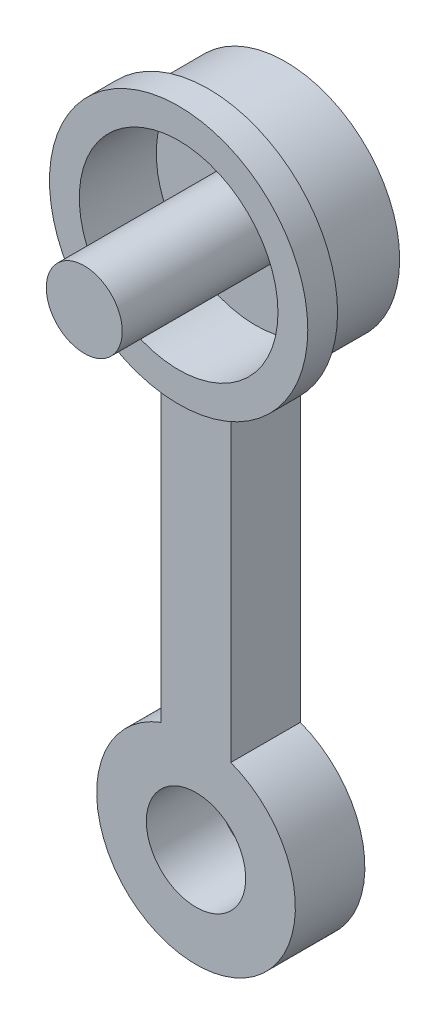
ISO-10303-21;
HEADER;
FILE_DESCRIPTION(('STEP AP214'),'2;1');
FILE_NAME('part.step','',(''),(''),'','','');
FILE_SCHEMA(('AUTOMOTIVE_DESIGN { 1 0 10303 214 1 1 1 1 }'));
ENDSEC;
DATA;
#1=APPLICATION_CONTEXT('core data for automotive mechanical design processes');
#2=APPLICATION_PROTOCOL_DEFINITION('international standard','automotive_design',2000,#1);
#3=PRODUCT_CONTEXT('',#1,'mechanical');
#4=PRODUCT('Part','Part','',(#3));
#5=PRODUCT_RELATED_PRODUCT_CATEGORY('part','',(#4));
#6=PRODUCT_DEFINITION_FORMATION('','',#4);
#7=PRODUCT_DEFINITION_CONTEXT('part definition',#1,'design');
#8=PRODUCT_DEFINITION('design','',#6,#7);
#9=PRODUCT_DEFINITION_SHAPE('','',#8);
#10=(LENGTH_UNIT() NAMED_UNIT(*) SI_UNIT(.MILLI.,.METRE.));
#11=(NAMED_UNIT(*) PLANE_ANGLE_UNIT() SI_UNIT($,.RADIAN.));
#12=(NAMED_UNIT(*) SI_UNIT($,.STERADIAN.) SOLID_ANGLE_UNIT());
#13=UNCERTAINTY_MEASURE_WITH_UNIT(LENGTH_MEASURE(1.E-05),#10,'distance_accuracy_value','');
#14=(GEOMETRIC_REPRESENTATION_CONTEXT(3) GLOBAL_UNCERTAINTY_ASSIGNED_CONTEXT((#13)) GLOBAL_UNIT_ASSIGNED_CONTEXT((#10,
#11,#12)) REPRESENTATION_CONTEXT('',''));
#15=CARTESIAN_POINT('',(0.,0.,0.));
#16=DIRECTION('',(0.,0.,1.));
#17=DIRECTION('',(1.,0.,0.));
#18=AXIS2_PLACEMENT_3D('',#15,#16,#17);
#19=CARTESIAN_POINT('',(0.,0.,10.75));
#20=DIRECTION('',(0.,0.,1.));
#21=DIRECTION('',(1.,0.,0.));
#22=AXIS2_PLACEMENT_3D('',#19,#20,#21);
#23=PLANE('',#22);
#24=CARTESIAN_POINT('',(0.,0.,10.75));
#25=DIRECTION('',(0.,0.,1.));
#26=DIRECTION('',(1.,0.,0.));
#27=AXIS2_PLACEMENT_3D('',#24,#25,#26);
#28=CIRCLE('',#27,10.);
#29=CARTESIAN_POINT('',(10.,0.,10.75));
#30=VERTEX_POINT('',#29);
#31=EDGE_CURVE('E388',#30,#30,#28,.T.);
#32=ORIENTED_EDGE('',*,*,#31,.F.);
#33=EDGE_LOOP('',(#32));
#34=FACE_BOUND('',#33,.T.);
#35=CARTESIAN_POINT('',(0.,0.,10.75));
#36=DIRECTION('',(0.,0.,1.));
#37=DIRECTION('',(1.,0.,0.));
#38=AXIS2_PLACEMENT_3D('',#35,#36,#37);
#39=CIRCLE('',#38,13.);
#40=CARTESIAN_POINT('',(13.,0.,10.75));
#41=VERTEX_POINT('',#40);
#42=EDGE_CURVE('E122',#41,#41,#39,.T.);
#43=ORIENTED_EDGE('',*,*,#42,.T.);
#44=EDGE_LOOP('',(#43));
#45=FACE_BOUND('',#44,.T.);
#46=ADVANCED_FACE('F49',(#34,#45),#23,.T.);
#47=CARTESIAN_POINT('',(0.,0.,7.75));
#48=DIRECTION('',(0.,0.,1.));
#49=DIRECTION('',(1.,0.,0.));
#50=AXIS2_PLACEMENT_3D('',#47,#48,#49);
#51=CYLINDRICAL_SURFACE('',#50,13.);
#52=CARTESIAN_POINT('',(0.,0.,9.));
#53=DIRECTION('',(0.,0.,-1.));
#54=DIRECTION('',(-1.,0.,0.));
#55=AXIS2_PLACEMENT_3D('',#52,#53,#54);
#56=CIRCLE('',#55,13.);
#57=CARTESIAN_POINT('',(3.50000000000001,-12.5199840255489,9.));
#58=VERTEX_POINT('',#57);
#59=CARTESIAN_POINT('',(-3.49999999999999,-12.5199840255489,9.));
#60=VERTEX_POINT('',#59);
#61=EDGE_CURVE('E110',#58,#60,#56,.T.);
#62=ORIENTED_EDGE('',*,*,#61,.F.);
#63=DIRECTION('',(0.,0.,1.));
#64=VECTOR('',#63,1.);
#65=CARTESIAN_POINT('',(3.50000000000001,-12.5199840255489,7.75));
#66=LINE('',#65,#64);
#67=CARTESIAN_POINT('',(3.50000000000001,-12.5199840255489,7.75));
#68=VERTEX_POINT('',#67);
#69=EDGE_CURVE('E156',#58,#68,#66,.F.);
#70=ORIENTED_EDGE('',*,*,#69,.T.);
#71=CARTESIAN_POINT('',(0.,0.,7.75));
#72=DIRECTION('',(0.,0.,1.));
#73=DIRECTION('',(1.,0.,0.));
#74=AXIS2_PLACEMENT_3D('',#71,#72,#73);
#75=CIRCLE('',#74,13.);
#76=CARTESIAN_POINT('',(-3.49999999999999,-12.5199840255489,7.75));
#77=VERTEX_POINT('',#76);
#78=EDGE_CURVE('E105',#68,#77,#75,.T.);
#79=ORIENTED_EDGE('',*,*,#78,.T.);
#80=DIRECTION('',(0.,0.,1.));
#81=VECTOR('',#80,1.);
#82=CARTESIAN_POINT('',(-3.49999999999999,-12.5199840255489,7.75));
#83=LINE('',#82,#81);
#84=EDGE_CURVE('E11',#77,#60,#83,.T.);
#85=ORIENTED_EDGE('',*,*,#84,.T.);
#86=EDGE_LOOP('',(#62,#70,#79,#85));
#87=FACE_BOUND('',#86,.T.);
#88=ORIENTED_EDGE('',*,*,#42,.F.);
#89=EDGE_LOOP('',(#88));
#90=FACE_BOUND('',#89,.T.);
#91=ADVANCED_FACE('F153',(#87,#90),#51,.T.);
#92=CARTESIAN_POINT('',(0.,0.,7.75));
#93=DIRECTION('',(0.,0.,1.));
#94=DIRECTION('',(1.,0.,0.));
#95=AXIS2_PLACEMENT_3D('',#92,#93,#94);
#96=PLANE('',#95);
#97=DIRECTION('',(0.,-1.,0.));
#98=VECTOR('',#97,1.);
#99=CARTESIAN_POINT('',(3.50000000000001,-10.2329555021434,7.75));
#100=LINE('',#99,#98);
#101=CARTESIAN_POINT('',(3.50000000000001,-10.9544511501033,7.75));
#102=VERTEX_POINT('',#101);
#103=EDGE_CURVE('E102',#102,#68,#100,.T.);
#104=ORIENTED_EDGE('',*,*,#103,.F.);
#105=CARTESIAN_POINT('',(0.,0.,7.75));
#106=DIRECTION('',(0.,0.,1.));
#107=DIRECTION('',(1.,0.,0.));
#108=AXIS2_PLACEMENT_3D('',#105,#106,#107);
#109=CIRCLE('',#108,11.5);
#110=CARTESIAN_POINT('',(-3.49999999999999,-10.9544511501033,7.74999999999999));
#111=VERTEX_POINT('',#110);
#112=EDGE_CURVE('E65',#102,#111,#109,.T.);
#113=ORIENTED_EDGE('',*,*,#112,.T.);
#114=DIRECTION('',(0.,1.,0.));
#115=VECTOR('',#114,1.);
#116=CARTESIAN_POINT('',(-3.49999999999999,-61.5,7.75));
#117=LINE('',#116,#115);
#118=EDGE_CURVE('E58',#77,#111,#117,.T.);
#119=ORIENTED_EDGE('',*,*,#118,.F.);
#120=ORIENTED_EDGE('',*,*,#78,.F.);
#121=EDGE_LOOP('',(#104,#113,#119,#120));
#122=FACE_BOUND('',#121,.T.);
#123=ADVANCED_FACE('F103',(#122),#96,.F.);
#124=CARTESIAN_POINT('',(0.,0.,0.));
#125=DIRECTION('',(0.,0.,1.));
#126=DIRECTION('',(1.,0.,0.));
#127=AXIS2_PLACEMENT_3D('',#124,#125,#126);
#128=PLANE('',#127);
#129=CARTESIAN_POINT('',(0.,0.,0.));
#130=DIRECTION('',(0.,0.,1.));
#131=DIRECTION('',(1.,0.,0.));
#132=AXIS2_PLACEMENT_3D('',#129,#130,#131);
#133=CIRCLE('',#132,11.5);
#134=CARTESIAN_POINT('',(11.5,0.,0.));
#135=VERTEX_POINT('',#134);
#136=EDGE_CURVE('E129',#135,#135,#133,.T.);
#137=ORIENTED_EDGE('',*,*,#136,.F.);
#138=EDGE_LOOP('',(#137));
#139=FACE_BOUND('',#138,.T.);
#140=ADVANCED_FACE('F51',(#139),#128,.F.);
#141=CARTESIAN_POINT('',(0.,-52.7249721603218,32.));
#142=DIRECTION('',(0.,0.,-1.));
#143=DIRECTION('',(-1.,0.,0.));
#144=AXIS2_PLACEMENT_3D('',#141,#142,#143);
#145=CYLINDRICAL_SURFACE('',#144,5.);
#146=CARTESIAN_POINT('',(0.,-52.7249721603218,2.));
#147=DIRECTION('',(0.,0.,-1.));
#148=DIRECTION('',(-1.,0.,0.));
#149=AXIS2_PLACEMENT_3D('',#146,#147,#148);
#150=CIRCLE('',#149,5.);
#151=CARTESIAN_POINT('',(-5.00000000000001,-52.7249721603218,2.));
#152=VERTEX_POINT('',#151);
#153=EDGE_CURVE('E146',#152,#152,#150,.T.);
#154=CARTESIAN_POINT('',(0.,-52.7249721603218,9.));
#155=DIRECTION('',(0.,0.,-1.));
#156=DIRECTION('',(-1.,0.,0.));
#157=AXIS2_PLACEMENT_3D('',#154,#155,#156);
#158=CIRCLE('',#157,5.);
#159=CARTESIAN_POINT('',(-5.00000000000001,-52.7249721603218,9.00000000000001));
#160=VERTEX_POINT('',#159);
#161=EDGE_CURVE('E142',#160,#160,#158,.T.);
#162=CARTESIAN_POINT('',(-5.00000000000001,-52.7249721603218,2.));
#163=CARTESIAN_POINT('',(-5.00000000000001,-52.7249721603218,2.07291666666666));
#164=CARTESIAN_POINT('',(-5.00000000000001,-52.7249721603218,2.14583333333333));
#165=CARTESIAN_POINT('',(-5.00000000000001,-52.7249721603218,2.29166666666667));
#166=CARTESIAN_POINT('',(-5.00000000000001,-52.7249721603218,2.36458333333333));
#167=CARTESIAN_POINT('',(-5.00000000000001,-52.7249721603218,2.51041666666667));
#168=CARTESIAN_POINT('',(-5.00000000000001,-52.7249721603218,2.58333333333333));
#169=CARTESIAN_POINT('',(-5.00000000000001,-52.7249721603218,2.72916666666667));
#170=CARTESIAN_POINT('',(-5.00000000000001,-52.7249721603218,2.80208333333333));
#171=CARTESIAN_POINT('',(-5.00000000000001,-52.7249721603218,2.94791666666667));
#172=CARTESIAN_POINT('',(-5.00000000000001,-52.7249721603218,3.02083333333333));
#173=CARTESIAN_POINT('',(-5.00000000000001,-52.7249721603218,3.16666666666667));
#174=CARTESIAN_POINT('',(-5.00000000000001,-52.7249721603218,3.23958333333333));
#175=CARTESIAN_POINT('',(-5.00000000000001,-52.7249721603218,3.38541666666667));
#176=CARTESIAN_POINT('',(-5.00000000000001,-52.7249721603218,3.45833333333333));
#177=CARTESIAN_POINT('',(-5.00000000000001,-52.7249721603218,3.60416666666667));
#178=CARTESIAN_POINT('',(-5.00000000000001,-52.7249721603218,3.67708333333333));
#179=CARTESIAN_POINT('',(-5.00000000000001,-52.7249721603218,3.82291666666667));
#180=CARTESIAN_POINT('',(-5.00000000000001,-52.7249721603218,3.89583333333333));
#181=CARTESIAN_POINT('',(-5.00000000000001,-52.7249721603218,4.04166666666667));
#182=CARTESIAN_POINT('',(-5.00000000000001,-52.7249721603218,4.11458333333333));
#183=CARTESIAN_POINT('',(-5.00000000000001,-52.7249721603218,4.26041666666667));
#184=CARTESIAN_POINT('',(-5.00000000000001,-52.7249721603218,4.33333333333333));
#185=CARTESIAN_POINT('',(-5.00000000000001,-52.7249721603218,4.47916666666667));
#186=CARTESIAN_POINT('',(-5.00000000000001,-52.7249721603218,4.55208333333333));
#187=CARTESIAN_POINT('',(-5.00000000000001,-52.7249721603218,4.69791666666667));
#188=CARTESIAN_POINT('',(-5.00000000000001,-52.7249721603218,4.77083333333333));
#189=CARTESIAN_POINT('',(-5.00000000000001,-52.7249721603218,4.91666666666667));
#190=CARTESIAN_POINT('',(-5.00000000000001,-52.7249721603218,4.98958333333333));
#191=CARTESIAN_POINT('',(-5.00000000000001,-52.7249721603218,5.13541666666667));
#192=CARTESIAN_POINT('',(-5.00000000000001,-52.7249721603218,5.20833333333333));
#193=CARTESIAN_POINT('',(-5.00000000000001,-52.7249721603218,5.35416666666667));
#194=CARTESIAN_POINT('',(-5.00000000000001,-52.7249721603218,5.42708333333333));
#195=CARTESIAN_POINT('',(-5.00000000000001,-52.7249721603218,5.57291666666667));
#196=CARTESIAN_POINT('',(-5.00000000000001,-52.7249721603218,5.64583333333333));
#197=CARTESIAN_POINT('',(-5.00000000000001,-52.7249721603218,5.79166666666667));
#198=CARTESIAN_POINT('',(-5.00000000000001,-52.7249721603218,5.86458333333334));
#199=CARTESIAN_POINT('',(-5.00000000000001,-52.7249721603218,6.01041666666667));
#200=CARTESIAN_POINT('',(-5.00000000000001,-52.7249721603218,6.08333333333334));
#201=CARTESIAN_POINT('',(-5.00000000000001,-52.7249721603218,6.22916666666667));
#202=CARTESIAN_POINT('',(-5.00000000000001,-52.7249721603218,6.30208333333334));
#203=CARTESIAN_POINT('',(-5.00000000000001,-52.7249721603218,6.44791666666667));
#204=CARTESIAN_POINT('',(-5.00000000000001,-52.7249721603218,6.52083333333334));
#205=CARTESIAN_POINT('',(-5.00000000000001,-52.7249721603218,6.66666666666667));
#206=CARTESIAN_POINT('',(-5.00000000000001,-52.7249721603218,6.73958333333334));
#207=CARTESIAN_POINT('',(-5.00000000000001,-52.7249721603218,6.88541666666667));
#208=CARTESIAN_POINT('',(-5.00000000000001,-52.7249721603218,6.95833333333334));
#209=CARTESIAN_POINT('',(-5.00000000000001,-52.7249721603218,7.10416666666667));
#210=CARTESIAN_POINT('',(-5.00000000000001,-52.7249721603218,7.17708333333334));
#211=CARTESIAN_POINT('',(-5.00000000000001,-52.7249721603218,7.32291666666667));
#212=CARTESIAN_POINT('',(-5.00000000000001,-52.7249721603218,7.39583333333334));
#213=CARTESIAN_POINT('',(-5.00000000000001,-52.7249721603218,7.54166666666667));
#214=CARTESIAN_POINT('',(-5.00000000000001,-52.7249721603218,7.61458333333334));
#215=CARTESIAN_POINT('',(-5.00000000000001,-52.7249721603218,7.76041666666667));
#216=CARTESIAN_POINT('',(-5.00000000000001,-52.7249721603218,7.83333333333334));
#217=CARTESIAN_POINT('',(-5.00000000000001,-52.7249721603218,7.97916666666667));
#218=CARTESIAN_POINT('',(-5.00000000000001,-52.7249721603218,8.05208333333334));
#219=CARTESIAN_POINT('',(-5.00000000000001,-52.7249721603218,8.19791666666667));
#220=CARTESIAN_POINT('',(-5.00000000000001,-52.7249721603218,8.27083333333334));
#221=CARTESIAN_POINT('',(-5.00000000000001,-52.7249721603218,8.41666666666667));
#222=CARTESIAN_POINT('',(-5.00000000000001,-52.7249721603218,8.48958333333334));
#223=CARTESIAN_POINT('',(-5.00000000000001,-52.7249721603218,8.63541666666667));
#224=CARTESIAN_POINT('',(-5.00000000000001,-52.7249721603218,8.70833333333334));
#225=CARTESIAN_POINT('',(-5.00000000000001,-52.7249721603218,8.85416666666667));
#226=CARTESIAN_POINT('',(-5.00000000000001,-52.7249721603218,8.92708333333334));
#227=CARTESIAN_POINT('',(-5.00000000000001,-52.7249721603218,9.00000000000001));
#228=B_SPLINE_CURVE_WITH_KNOTS('',3,(#162,#163,#164,#165,#166,#167,#168,#169,#170,#171,#172,
#173,#174,#175,#176,#177,#178,#179,#180,#181,#182,#183,#184,#185,#186,#187,#188,#189,#190,#191,
#192,#193,#194,#195,#196,#197,#198,#199,#200,#201,#202,#203,#204,#205,#206,#207,#208,#209,#210,
#211,#212,#213,#214,#215,#216,#217,#218,#219,#220,#221,#222,#223,#224,#225,#226,#227),
.UNSPECIFIED.,.F.,.F.,(4,2,2,2,2,2,2,2,2,2,2,2,2,2,2,2,2,2,2,2,2,2,2,2,2,2,2,2,2,2,2,2,4),(0.,
0.21875,0.4375,0.656250000000001,0.875000000000001,1.09375,1.3125,1.53125,1.75,1.96875,2.1875,
2.40625,2.625,2.84375,3.0625,3.28125,3.5,3.71875,3.9375,4.15625,4.375,4.59375,4.8125,5.03125,
5.25,5.46875,5.68750000000001,5.90625000000001,6.12500000000001,6.34375000000001,
6.56250000000001,6.78125000000001,7.00000000000001),.UNSPECIFIED.);
#229=EDGE_CURVE('BSEAM224',#152,#160,#228,.T.);
#230=ORIENTED_EDGE('',*,*,#153,.T.);
#231=ORIENTED_EDGE('',*,*,#161,.F.);
#232=ORIENTED_EDGE('',*,*,#229,.T.);
#233=ORIENTED_EDGE('',*,*,#229,.F.);
#234=EDGE_LOOP('',(#230,#232,#231,#233));
#235=FACE_BOUND('',#234,.T.);
#236=ADVANCED_FACE('F224',(#235),#145,.F.);
#237=CARTESIAN_POINT('',(0.,-52.7249721603218,37.2842712474619));
#238=DIRECTION('',(0.,0.,-1.));
#239=DIRECTION('',(-1.,0.,0.));
#240=AXIS2_PLACEMENT_3D('',#237,#238,#239);
#241=CYLINDRICAL_SURFACE('',#240,10.);
#242=CARTESIAN_POINT('',(0.,-52.7249721603218,2.));
#243=DIRECTION('',(0.,0.,-1.));
#244=DIRECTION('',(-1.,0.,0.));
#245=AXIS2_PLACEMENT_3D('',#242,#243,#244);
#246=CIRCLE('',#245,10.);
#247=CARTESIAN_POINT('',(3.50000000000001,-43.3574751627242,2.));
#248=VERTEX_POINT('',#247);
#249=CARTESIAN_POINT('',(-3.49999999999999,-43.3574751627242,2.));
#250=VERTEX_POINT('',#249);
#251=EDGE_CURVE('E145',#248,#250,#246,.T.);
#252=ORIENTED_EDGE('',*,*,#251,.F.);
#253=DIRECTION('',(0.,0.,-1.));
#254=VECTOR('',#253,1.);
#255=CARTESIAN_POINT('',(3.50000000000001,-43.3574751627242,37.2842712474619));
#256=LINE('',#255,#254);
#257=CARTESIAN_POINT('',(3.50000000000001,-43.3574751627242,9.));
#258=VERTEX_POINT('',#257);
#259=EDGE_CURVE('E178',#248,#258,#256,.F.);
#260=ORIENTED_EDGE('',*,*,#259,.T.);
#261=CARTESIAN_POINT('',(0.,-52.7249721603218,9.));
#262=DIRECTION('',(0.,0.,-1.));
#263=DIRECTION('',(-1.,0.,0.));
#264=AXIS2_PLACEMENT_3D('',#261,#262,#263);
#265=CIRCLE('',#264,10.);
#266=CARTESIAN_POINT('',(-3.49999999999999,-43.3574751627242,9.));
#267=VERTEX_POINT('',#266);
#268=EDGE_CURVE('E174',#267,#258,#265,.F.);
#269=ORIENTED_EDGE('',*,*,#268,.F.);
#270=DIRECTION('',(0.,0.,-1.));
#271=VECTOR('',#270,1.);
#272=CARTESIAN_POINT('',(-3.49999999999999,-43.3574751627242,37.2842712474619));
#273=LINE('',#272,#271);
#274=EDGE_CURVE('E133',#267,#250,#273,.T.);
#275=ORIENTED_EDGE('',*,*,#274,.T.);
#276=EDGE_LOOP('',(#252,#260,#269,#275));
#277=FACE_BOUND('',#276,.T.);
#278=ADVANCED_FACE('F196',(#277),#241,.T.);
#279=CARTESIAN_POINT('',(-5.49999999999999,-61.5,2.));
#280=DIRECTION('',(0.,0.,1.));
#281=DIRECTION('',(1.,0.,0.));
#282=AXIS2_PLACEMENT_3D('',#279,#280,#281);
#283=PLANE('',#282);
#284=ORIENTED_EDGE('',*,*,#153,.F.);
#285=EDGE_LOOP('',(#284));
#286=FACE_BOUND('',#285,.T.);
#287=CARTESIAN_POINT('',(0.,0.,2.));
#288=DIRECTION('',(0.,0.,1.));
#289=DIRECTION('',(1.,0.,0.));
#290=AXIS2_PLACEMENT_3D('',#287,#288,#289);
#291=CIRCLE('',#290,11.5);
#292=CARTESIAN_POINT('',(-3.49999999999999,-10.9544511501033,2.));
#293=VERTEX_POINT('',#292);
#294=CARTESIAN_POINT('',(3.50000000000001,-10.9544511501033,2.));
#295=VERTEX_POINT('',#294);
#296=EDGE_CURVE('E136',#293,#295,#291,.T.);
#297=ORIENTED_EDGE('',*,*,#296,.T.);
#298=DIRECTION('',(0.,-1.,0.));
#299=VECTOR('',#298,1.);
#300=CARTESIAN_POINT('',(3.50000000000001,-10.2329555021434,2.));
#301=LINE('',#300,#299);
#302=EDGE_CURVE('E127',#295,#248,#301,.T.);
#303=ORIENTED_EDGE('',*,*,#302,.T.);
#304=ORIENTED_EDGE('',*,*,#251,.T.);
#305=DIRECTION('',(0.,1.,0.));
#306=VECTOR('',#305,1.);
#307=CARTESIAN_POINT('',(-3.49999999999999,-61.5,2.));
#308=LINE('',#307,#306);
#309=EDGE_CURVE('E73',#250,#293,#308,.T.);
#310=ORIENTED_EDGE('',*,*,#309,.T.);
#311=EDGE_LOOP('',(#297,#303,#304,#310));
#312=FACE_BOUND('',#311,.T.);
#313=ADVANCED_FACE('F192',(#286,#312),#283,.F.);
#314=CARTESIAN_POINT('',(-3.49999999999999,-61.5,-49.7427275232491));
#315=DIRECTION('',(-1.,0.,0.));
#316=DIRECTION('',(0.,0.,1.));
#317=AXIS2_PLACEMENT_3D('',#314,#315,#316);
#318=PLANE('',#317);
#319=ORIENTED_EDGE('',*,*,#84,.F.);
#320=ORIENTED_EDGE('',*,*,#118,.T.);
#321=DIRECTION('',(0.,0.,1.));
#322=VECTOR('',#321,1.);
#323=CARTESIAN_POINT('',(-3.49999999999999,-10.9544511501033,-32.5269119345812));
#324=LINE('',#323,#322);
#325=EDGE_CURVE('E120',#293,#111,#324,.T.);
#326=ORIENTED_EDGE('',*,*,#325,.F.);
#327=ORIENTED_EDGE('',*,*,#309,.F.);
#328=ORIENTED_EDGE('',*,*,#274,.F.);
#329=DIRECTION('',(0.,-1.,0.));
#330=VECTOR('',#329,1.);
#331=CARTESIAN_POINT('',(-3.49999999999999,-61.5,9.));
#332=LINE('',#331,#330);
#333=EDGE_CURVE('E184',#60,#267,#332,.T.);
#334=ORIENTED_EDGE('',*,*,#333,.F.);
#335=EDGE_LOOP('',(#319,#320,#326,#327,#328,#334));
#336=FACE_BOUND('',#335,.T.);
#337=ADVANCED_FACE('F150',(#336),#318,.T.);
#338=CARTESIAN_POINT('',(3.50000000000001,-10.2329555021434,-49.7427275232491));
#339=DIRECTION('',(1.,0.,0.));
#340=DIRECTION('',(0.,0.,-1.));
#341=AXIS2_PLACEMENT_3D('',#338,#339,#340);
#342=PLANE('',#341);
#343=ORIENTED_EDGE('',*,*,#69,.F.);
#344=DIRECTION('',(0.,1.,0.));
#345=VECTOR('',#344,1.);
#346=CARTESIAN_POINT('',(3.50000000000001,-10.2329555021434,9.));
#347=LINE('',#346,#345);
#348=EDGE_CURVE('E181',#258,#58,#347,.T.);
#349=ORIENTED_EDGE('',*,*,#348,.F.);
#350=ORIENTED_EDGE('',*,*,#259,.F.);
#351=ORIENTED_EDGE('',*,*,#302,.F.);
#352=DIRECTION('',(0.,0.,1.));
#353=VECTOR('',#352,1.);
#354=CARTESIAN_POINT('',(3.50000000000001,-10.9544511501033,-32.5269119345812));
#355=LINE('',#354,#353);
#356=EDGE_CURVE('E117',#102,#295,#355,.F.);
#357=ORIENTED_EDGE('',*,*,#356,.F.);
#358=ORIENTED_EDGE('',*,*,#103,.T.);
#359=EDGE_LOOP('',(#343,#349,#350,#351,#357,#358));
#360=FACE_BOUND('',#359,.T.);
#361=ADVANCED_FACE('F124',(#360),#342,.T.);
#362=CARTESIAN_POINT('',(-5.49999999999999,-61.5,9.));
#363=DIRECTION('',(0.,0.,-1.));
#364=DIRECTION('',(-1.,0.,0.));
#365=AXIS2_PLACEMENT_3D('',#362,#363,#364);
#366=PLANE('',#365);
#367=ORIENTED_EDGE('',*,*,#161,.T.);
#368=EDGE_LOOP('',(#367));
#369=FACE_BOUND('',#368,.T.);
#370=ORIENTED_EDGE('',*,*,#348,.T.);
#371=ORIENTED_EDGE('',*,*,#61,.T.);
#372=ORIENTED_EDGE('',*,*,#333,.T.);
#373=ORIENTED_EDGE('',*,*,#268,.T.);
#374=EDGE_LOOP('',(#370,#371,#372,#373));
#375=FACE_BOUND('',#374,.T.);
#376=ADVANCED_FACE('F199',(#369,#375),#366,.F.);
#377=CARTESIAN_POINT('',(0.,0.,-32.5269119345812));
#378=DIRECTION('',(0.,0.,1.));
#379=DIRECTION('',(1.,0.,0.));
#380=AXIS2_PLACEMENT_3D('',#377,#378,#379);
#381=CYLINDRICAL_SURFACE('',#380,11.5);
#382=ORIENTED_EDGE('',*,*,#356,.T.);
#383=ORIENTED_EDGE('',*,*,#296,.F.);
#384=ORIENTED_EDGE('',*,*,#325,.T.);
#385=ORIENTED_EDGE('',*,*,#112,.F.);
#386=EDGE_LOOP('',(#382,#383,#384,#385));
#387=FACE_BOUND('',#386,.T.);
#388=ORIENTED_EDGE('',*,*,#136,.T.);
#389=EDGE_LOOP('',(#388));
#390=FACE_BOUND('',#389,.T.);
#391=ADVANCED_FACE('F115',(#387,#390),#381,.T.);
#392=CARTESIAN_POINT('',(0.,0.,3.));
#393=DIRECTION('',(0.,0.,1.));
#394=DIRECTION('',(1.,0.,0.));
#395=AXIS2_PLACEMENT_3D('',#392,#393,#394);
#396=CYLINDRICAL_SURFACE('',#395,10.);
#397=CARTESIAN_POINT('',(0.,0.,3.));
#398=DIRECTION('',(0.,0.,1.));
#399=DIRECTION('',(1.,0.,0.));
#400=AXIS2_PLACEMENT_3D('',#397,#398,#399);
#401=CIRCLE('',#400,10.);
#402=CARTESIAN_POINT('',(10.,0.,3.));
#403=VERTEX_POINT('',#402);
#404=EDGE_CURVE('E163',#403,#403,#401,.T.);
#405=ORIENTED_EDGE('',*,*,#404,.F.);
#406=EDGE_LOOP('',(#405));
#407=FACE_BOUND('',#406,.T.);
#408=ORIENTED_EDGE('',*,*,#31,.T.);
#409=EDGE_LOOP('',(#408));
#410=FACE_BOUND('',#409,.T.);
#411=ADVANCED_FACE('F208',(#407,#410),#396,.F.);
#412=CARTESIAN_POINT('',(0.,0.,3.));
#413=DIRECTION('',(0.,0.,1.));
#414=DIRECTION('',(1.,0.,0.));
#415=AXIS2_PLACEMENT_3D('',#412,#413,#414);
#416=PLANE('',#415);
#417=CARTESIAN_POINT('',(0.,0.,3.));
#418=DIRECTION('',(0.,0.,1.));
#419=DIRECTION('',(1.,0.,0.));
#420=AXIS2_PLACEMENT_3D('',#417,#418,#419);
#421=CIRCLE('',#420,3.825);
#422=CARTESIAN_POINT('',(3.825,0.,3.));
#423=VERTEX_POINT('',#422);
#424=EDGE_CURVE('E384',#423,#423,#421,.T.);
#425=ORIENTED_EDGE('',*,*,#424,.F.);
#426=EDGE_LOOP('',(#425));
#427=FACE_BOUND('',#426,.T.);
#428=ORIENTED_EDGE('',*,*,#404,.T.);
#429=EDGE_LOOP('',(#428));
#430=FACE_BOUND('',#429,.T.);
#431=ADVANCED_FACE('F266',(#427,#430),#416,.T.);
#432=CARTESIAN_POINT('',(0.,0.,21.5687337521542));
#433=DIRECTION('',(0.,0.,-1.));
#434=DIRECTION('',(-1.,0.,0.));
#435=AXIS2_PLACEMENT_3D('',#432,#433,#434);
#436=CYLINDRICAL_SURFACE('',#435,3.825);
#437=ORIENTED_EDGE('',*,*,#424,.T.);
#438=EDGE_LOOP('',(#437));
#439=FACE_BOUND('',#438,.T.);
#440=CARTESIAN_POINT('',(0.,0.,20.25));
#441=DIRECTION('',(0.,0.,1.));
#442=DIRECTION('',(1.,0.,0.));
#443=AXIS2_PLACEMENT_3D('',#440,#441,#442);
#444=CIRCLE('',#443,3.825);
#445=CARTESIAN_POINT('',(3.825,0.,20.25));
#446=VERTEX_POINT('',#445);
#447=EDGE_CURVE('E381',#446,#446,#444,.T.);
#448=ORIENTED_EDGE('',*,*,#447,.F.);
#449=EDGE_LOOP('',(#448));
#450=FACE_BOUND('',#449,.T.);
#451=ADVANCED_FACE('F277',(#439,#450),#436,.T.);
#452=CARTESIAN_POINT('',(0.,0.,20.25));
#453=DIRECTION('',(0.,0.,1.));
#454=DIRECTION('',(1.,0.,0.));
#455=AXIS2_PLACEMENT_3D('',#452,#453,#454);
#456=PLANE('',#455);
#457=ORIENTED_EDGE('',*,*,#447,.T.);
#458=EDGE_LOOP('',(#457));
#459=FACE_BOUND('',#458,.T.);
#460=ADVANCED_FACE('F287',(#459),#456,.T.);
#461=CLOSED_SHELL('',(#46,#91,#123,#140,#236,#278,#313,#337,#361,#376,#391,#411,#431,#451,#460));
#462=MANIFOLD_SOLID_BREP('B2',#461);
#463=ADVANCED_BREP_SHAPE_REPRESENTATION('',(#18,#462),#14);
#464=SHAPE_DEFINITION_REPRESENTATION(#9,#463);
ENDSEC;
END-ISO-10303-21;
